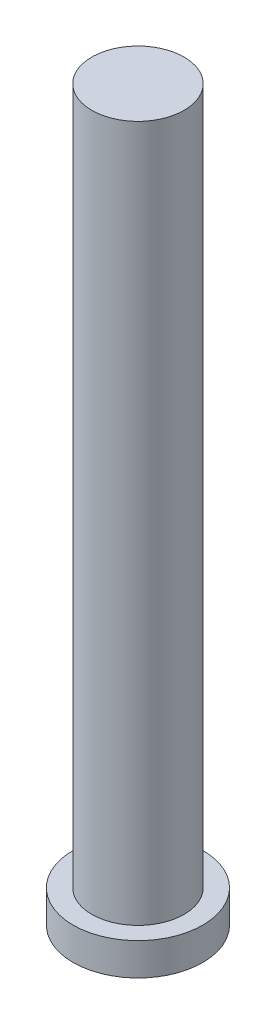
ISO-10303-21;
HEADER;
FILE_DESCRIPTION(('STEP AP214'),'2;1');
FILE_NAME('part.step','',(''),(''),'','','');
FILE_SCHEMA(('AUTOMOTIVE_DESIGN { 1 0 10303 214 1 1 1 1 }'));
ENDSEC;
DATA;
#1=APPLICATION_CONTEXT('core data for automotive mechanical design processes');
#2=APPLICATION_PROTOCOL_DEFINITION('international standard','automotive_design',2000,#1);
#3=PRODUCT_CONTEXT('',#1,'mechanical');
#4=PRODUCT('Part','Part','',(#3));
#5=PRODUCT_RELATED_PRODUCT_CATEGORY('part','',(#4));
#6=PRODUCT_DEFINITION_FORMATION('','',#4);
#7=PRODUCT_DEFINITION_CONTEXT('part definition',#1,'design');
#8=PRODUCT_DEFINITION('design','',#6,#7);
#9=PRODUCT_DEFINITION_SHAPE('','',#8);
#10=(LENGTH_UNIT() NAMED_UNIT(*) SI_UNIT(.MILLI.,.METRE.));
#11=(NAMED_UNIT(*) PLANE_ANGLE_UNIT() SI_UNIT($,.RADIAN.));
#12=(NAMED_UNIT(*) SI_UNIT($,.STERADIAN.) SOLID_ANGLE_UNIT());
#13=UNCERTAINTY_MEASURE_WITH_UNIT(LENGTH_MEASURE(1.E-05),#10,'distance_accuracy_value','');
#14=(GEOMETRIC_REPRESENTATION_CONTEXT(3) GLOBAL_UNCERTAINTY_ASSIGNED_CONTEXT((#13)) GLOBAL_UNIT_ASSIGNED_CONTEXT((#10,
#11,#12)) REPRESENTATION_CONTEXT('',''));
#15=CARTESIAN_POINT('',(0.,0.,0.));
#16=DIRECTION('',(0.,0.,1.));
#17=DIRECTION('',(1.,0.,0.));
#18=AXIS2_PLACEMENT_3D('',#15,#16,#17);
#19=CARTESIAN_POINT('',(0.,2.,0.));
#20=DIRECTION('',(0.,-1.,0.));
#21=DIRECTION('',(0.,0.,-1.));
#22=AXIS2_PLACEMENT_3D('',#19,#20,#21);
#23=CYLINDRICAL_SURFACE('',#22,4.);
#24=CARTESIAN_POINT('',(0.,2.,0.));
#25=DIRECTION('',(0.,1.,0.));
#26=DIRECTION('',(0.,0.,1.));
#27=AXIS2_PLACEMENT_3D('',#24,#25,#26);
#28=CIRCLE('',#27,4.);
#29=CARTESIAN_POINT('',(0.,2.,4.));
#30=VERTEX_POINT('',#29);
#31=EDGE_CURVE('E44',#30,#30,#28,.T.);
#32=ORIENTED_EDGE('',*,*,#31,.F.);
#33=EDGE_LOOP('',(#32));
#34=FACE_BOUND('',#33,.T.);
#35=CARTESIAN_POINT('',(0.,0.,0.));
#36=DIRECTION('',(0.,1.,0.));
#37=DIRECTION('',(0.,0.,1.));
#38=AXIS2_PLACEMENT_3D('',#35,#36,#37);
#39=CIRCLE('',#38,4.);
#40=CARTESIAN_POINT('',(0.,0.,4.));
#41=VERTEX_POINT('',#40);
#42=EDGE_CURVE('E40',#41,#41,#39,.T.);
#43=ORIENTED_EDGE('',*,*,#42,.T.);
#44=EDGE_LOOP('',(#43));
#45=FACE_BOUND('',#44,.T.);
#46=ADVANCED_FACE('F37',(#34,#45),#23,.T.);
#47=CARTESIAN_POINT('',(0.,2.,0.));
#48=DIRECTION('',(0.,1.,0.));
#49=DIRECTION('',(0.,0.,1.));
#50=AXIS2_PLACEMENT_3D('',#47,#48,#49);
#51=PLANE('',#50);
#52=CARTESIAN_POINT('',(0.,2.,0.));
#53=DIRECTION('',(0.,1.,0.));
#54=DIRECTION('',(0.,0.,1.));
#55=AXIS2_PLACEMENT_3D('',#52,#53,#54);
#56=CIRCLE('',#55,2.85);
#57=CARTESIAN_POINT('',(0.,2.,2.85));
#58=VERTEX_POINT('',#57);
#59=EDGE_CURVE('E10',#58,#58,#56,.T.);
#60=ORIENTED_EDGE('',*,*,#59,.F.);
#61=EDGE_LOOP('',(#60));
#62=FACE_BOUND('',#61,.T.);
#63=ORIENTED_EDGE('',*,*,#31,.T.);
#64=EDGE_LOOP('',(#63));
#65=FACE_BOUND('',#64,.T.);
#66=ADVANCED_FACE('F61',(#62,#65),#51,.T.);
#67=CARTESIAN_POINT('',(0.,0.,0.));
#68=DIRECTION('',(0.,1.,0.));
#69=DIRECTION('',(0.,0.,1.));
#70=AXIS2_PLACEMENT_3D('',#67,#68,#69);
#71=PLANE('',#70);
#72=ORIENTED_EDGE('',*,*,#42,.F.);
#73=EDGE_LOOP('',(#72));
#74=FACE_BOUND('',#73,.T.);
#75=ADVANCED_FACE('F58',(#74),#71,.F.);
#76=CARTESIAN_POINT('',(0.,45.,0.));
#77=DIRECTION('',(0.,-1.,0.));
#78=DIRECTION('',(0.,0.,-1.));
#79=AXIS2_PLACEMENT_3D('',#76,#77,#78);
#80=CYLINDRICAL_SURFACE('',#79,2.85);
#81=CARTESIAN_POINT('',(0.,45.,0.));
#82=DIRECTION('',(0.,1.,0.));
#83=DIRECTION('',(0.,0.,1.));
#84=AXIS2_PLACEMENT_3D('',#81,#82,#83);
#85=CIRCLE('',#84,2.85);
#86=CARTESIAN_POINT('',(0.,45.,2.85));
#87=VERTEX_POINT('',#86);
#88=EDGE_CURVE('E50',#87,#87,#85,.T.);
#89=ORIENTED_EDGE('',*,*,#88,.F.);
#90=EDGE_LOOP('',(#89));
#91=FACE_BOUND('',#90,.T.);
#92=ORIENTED_EDGE('',*,*,#59,.T.);
#93=EDGE_LOOP('',(#92));
#94=FACE_BOUND('',#93,.T.);
#95=ADVANCED_FACE('F60',(#91,#94),#80,.T.);
#96=CARTESIAN_POINT('',(0.,45.,0.));
#97=DIRECTION('',(0.,1.,0.));
#98=DIRECTION('',(0.,0.,1.));
#99=AXIS2_PLACEMENT_3D('',#96,#97,#98);
#100=PLANE('',#99);
#101=ORIENTED_EDGE('',*,*,#88,.T.);
#102=EDGE_LOOP('',(#101));
#103=FACE_BOUND('',#102,.T.);
#104=ADVANCED_FACE('F67',(#103),#100,.T.);
#105=CLOSED_SHELL('',(#46,#66,#75,#95,#104));
#106=MANIFOLD_SOLID_BREP('B2',#105);
#107=ADVANCED_BREP_SHAPE_REPRESENTATION('',(#18,#106),#14);
#108=SHAPE_DEFINITION_REPRESENTATION(#9,#107);
ENDSEC;
END-ISO-10303-21;
